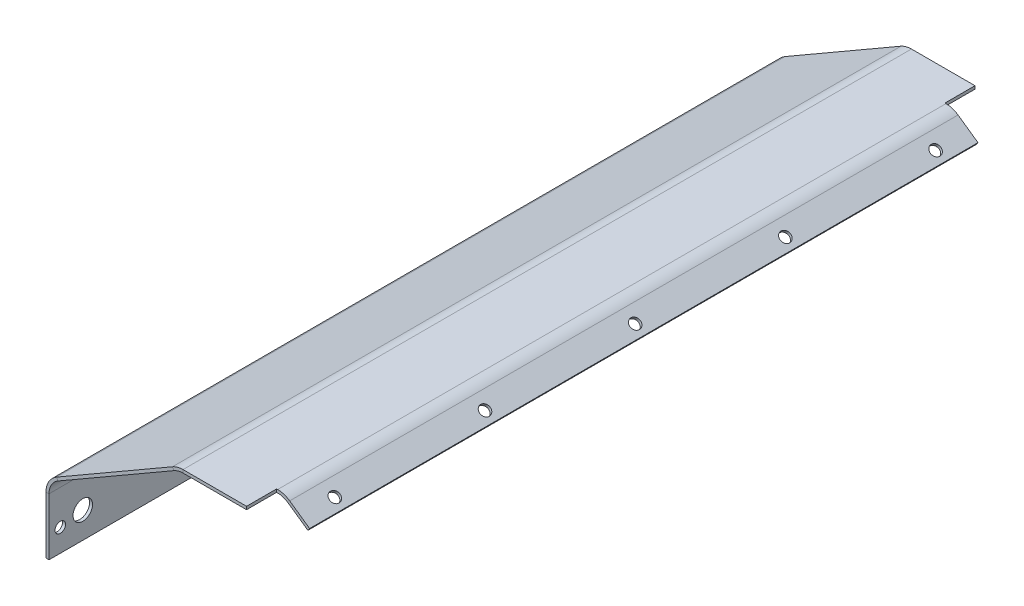
ISO-10303-21;
HEADER;
FILE_DESCRIPTION(('STEP AP214'),'2;1');
FILE_NAME('part.step','',(''),(''),'','','');
FILE_SCHEMA(('AUTOMOTIVE_DESIGN { 1 0 10303 214 1 1 1 1 }'));
ENDSEC;
DATA;
#1=APPLICATION_CONTEXT('core data for automotive mechanical design processes');
#2=APPLICATION_PROTOCOL_DEFINITION('international standard','automotive_design',2000,#1);
#3=PRODUCT_CONTEXT('',#1,'mechanical');
#4=PRODUCT('Part','Part','',(#3));
#5=PRODUCT_RELATED_PRODUCT_CATEGORY('part','',(#4));
#6=PRODUCT_DEFINITION_FORMATION('','',#4);
#7=PRODUCT_DEFINITION_CONTEXT('part definition',#1,'design');
#8=PRODUCT_DEFINITION('design','',#6,#7);
#9=PRODUCT_DEFINITION_SHAPE('','',#8);
#10=(LENGTH_UNIT() NAMED_UNIT(*) SI_UNIT(.MILLI.,.METRE.));
#11=(NAMED_UNIT(*) PLANE_ANGLE_UNIT() SI_UNIT($,.RADIAN.));
#12=(NAMED_UNIT(*) SI_UNIT($,.STERADIAN.) SOLID_ANGLE_UNIT());
#13=UNCERTAINTY_MEASURE_WITH_UNIT(LENGTH_MEASURE(1.E-05),#10,'distance_accuracy_value','');
#14=(GEOMETRIC_REPRESENTATION_CONTEXT(3) GLOBAL_UNCERTAINTY_ASSIGNED_CONTEXT((#13)) GLOBAL_UNIT_ASSIGNED_CONTEXT((#10,
#11,#12)) REPRESENTATION_CONTEXT('',''));
#15=CARTESIAN_POINT('',(0.,0.,0.));
#16=DIRECTION('',(0.,0.,1.));
#17=DIRECTION('',(1.,0.,0.));
#18=AXIS2_PLACEMENT_3D('',#15,#16,#17);
#19=CARTESIAN_POINT('',(0.,15.5717967697245,242.5));
#20=DIRECTION('',(0.,0.,1.));
#21=DIRECTION('',(1.,0.,0.));
#22=AXIS2_PLACEMENT_3D('',#19,#20,#21);
#23=PLANE('',#22);
#24=DIRECTION('',(-1.,0.,0.));
#25=VECTOR('',#24,1.);
#26=CARTESIAN_POINT('',(0.,15.5717967697245,242.5));
#27=LINE('',#26,#25);
#28=CARTESIAN_POINT('',(0.,15.5717967697245,242.5));
#29=VERTEX_POINT('',#28);
#30=CARTESIAN_POINT('',(-2.00000000000001,15.5717967697245,242.5));
#31=VERTEX_POINT('',#30);
#32=EDGE_CURVE('E332',#29,#31,#27,.T.);
#33=ORIENTED_EDGE('',*,*,#32,.F.);
#34=CARTESIAN_POINT('',(12.,15.5717967697245,242.5));
#35=DIRECTION('',(0.,0.,1.));
#36=DIRECTION('',(1.,0.,0.));
#37=AXIS2_PLACEMENT_3D('',#34,#35,#36);
#38=CIRCLE('',#37,12.);
#39=CARTESIAN_POINT('',(5.99999999999997,25.9641016151378,242.5));
#40=VERTEX_POINT('',#39);
#41=EDGE_CURVE('E242',#29,#40,#38,.F.);
#42=ORIENTED_EDGE('',*,*,#41,.T.);
#43=DIRECTION('',(0.500000000000001,-0.866025403784438,0.));
#44=VECTOR('',#43,1.);
#45=CARTESIAN_POINT('',(4.99999999999997,27.6961524227066,242.5));
#46=LINE('',#45,#44);
#47=CARTESIAN_POINT('',(4.99999999999997,27.6961524227066,242.5));
#48=VERTEX_POINT('',#47);
#49=EDGE_CURVE('E330',#48,#40,#46,.T.);
#50=ORIENTED_EDGE('',*,*,#49,.F.);
#51=CARTESIAN_POINT('',(12.,15.5717967697245,242.5));
#52=DIRECTION('',(0.,0.,1.));
#53=DIRECTION('',(1.,0.,0.));
#54=AXIS2_PLACEMENT_3D('',#51,#52,#53);
#55=CIRCLE('',#54,14.);
#56=EDGE_CURVE('E230',#31,#48,#55,.F.);
#57=ORIENTED_EDGE('',*,*,#56,.F.);
#58=EDGE_LOOP('',(#33,#42,#50,#57));
#59=FACE_BOUND('',#58,.T.);
#60=ADVANCED_FACE('F50',(#59),#23,.T.);
#61=CARTESIAN_POINT('',(4.99999999999997,27.6961524227066,242.5));
#62=DIRECTION('',(0.,0.,1.));
#63=DIRECTION('',(1.,0.,0.));
#64=AXIS2_PLACEMENT_3D('',#61,#62,#63);
#65=PLANE('',#64);
#66=DIRECTION('',(0.,1.,0.));
#67=VECTOR('',#66,1.);
#68=CARTESIAN_POINT('',(0.,-22.5,242.5));
#69=LINE('',#68,#67);
#70=CARTESIAN_POINT('',(0.,-22.5,242.5));
#71=VERTEX_POINT('',#70);
#72=EDGE_CURVE('E239',#71,#29,#69,.T.);
#73=ORIENTED_EDGE('',*,*,#72,.T.);
#74=ORIENTED_EDGE('',*,*,#32,.T.);
#75=DIRECTION('',(0.,1.,0.));
#76=VECTOR('',#75,1.);
#77=CARTESIAN_POINT('',(-2.,-22.5,242.5));
#78=LINE('',#77,#76);
#79=CARTESIAN_POINT('',(-2.,-22.5,242.5));
#80=VERTEX_POINT('',#79);
#81=EDGE_CURVE('E233',#80,#31,#78,.T.);
#82=ORIENTED_EDGE('',*,*,#81,.F.);
#83=DIRECTION('',(-1.,0.,0.));
#84=VECTOR('',#83,1.);
#85=CARTESIAN_POINT('',(0.,-22.5,242.5));
#86=LINE('',#85,#84);
#87=EDGE_CURVE('E236',#71,#80,#86,.T.);
#88=ORIENTED_EDGE('',*,*,#87,.F.);
#89=EDGE_LOOP('',(#73,#74,#82,#88));
#90=FACE_BOUND('',#89,.T.);
#91=ADVANCED_FACE('F468',(#90),#65,.T.);
#92=CARTESIAN_POINT('',(5.99999999999997,25.9641016151378,-242.5));
#93=DIRECTION('',(0.,0.,-1.));
#94=DIRECTION('',(-1.,0.,0.));
#95=AXIS2_PLACEMENT_3D('',#92,#93,#94);
#96=PLANE('',#95);
#97=DIRECTION('',(-0.500000000000001,0.866025403784438,0.));
#98=VECTOR('',#97,1.);
#99=CARTESIAN_POINT('',(5.99999999999997,25.9641016151378,-242.5));
#100=LINE('',#99,#98);
#101=CARTESIAN_POINT('',(5.99999999999997,25.9641016151378,-242.5));
#102=VERTEX_POINT('',#101);
#103=CARTESIAN_POINT('',(4.99999999999997,27.6961524227066,-242.5));
#104=VERTEX_POINT('',#103);
#105=EDGE_CURVE('E328',#102,#104,#100,.T.);
#106=ORIENTED_EDGE('',*,*,#105,.F.);
#107=CARTESIAN_POINT('',(12.,15.5717967697245,-242.5));
#108=DIRECTION('',(0.,0.,1.));
#109=DIRECTION('',(1.,0.,0.));
#110=AXIS2_PLACEMENT_3D('',#107,#108,#109);
#111=CIRCLE('',#110,12.);
#112=CARTESIAN_POINT('',(0.,15.5717967697245,-242.5));
#113=VERTEX_POINT('',#112);
#114=EDGE_CURVE('E273',#113,#102,#111,.F.);
#115=ORIENTED_EDGE('',*,*,#114,.F.);
#116=DIRECTION('',(1.,0.,0.));
#117=VECTOR('',#116,1.);
#118=CARTESIAN_POINT('',(-2.00000000000001,15.5717967697245,-242.5));
#119=LINE('',#118,#117);
#120=CARTESIAN_POINT('',(-2.00000000000001,15.5717967697245,-242.5));
#121=VERTEX_POINT('',#120);
#122=EDGE_CURVE('E326',#121,#113,#119,.T.);
#123=ORIENTED_EDGE('',*,*,#122,.F.);
#124=CARTESIAN_POINT('',(12.,15.5717967697245,-242.5));
#125=DIRECTION('',(0.,0.,1.));
#126=DIRECTION('',(1.,0.,0.));
#127=AXIS2_PLACEMENT_3D('',#124,#125,#126);
#128=CIRCLE('',#127,14.);
#129=EDGE_CURVE('E261',#121,#104,#128,.F.);
#130=ORIENTED_EDGE('',*,*,#129,.T.);
#131=EDGE_LOOP('',(#106,#115,#123,#130));
#132=FACE_BOUND('',#131,.T.);
#133=ADVANCED_FACE('F452',(#132),#96,.T.);
#134=CARTESIAN_POINT('',(-2.00000000000001,15.5717967697245,-242.5));
#135=DIRECTION('',(0.,0.,-1.));
#136=DIRECTION('',(-1.,0.,0.));
#137=AXIS2_PLACEMENT_3D('',#134,#135,#136);
#138=PLANE('',#137);
#139=DIRECTION('',(0.866025403784438,0.500000000000001,0.));
#140=VECTOR('',#139,1.);
#141=CARTESIAN_POINT('',(0.,22.5,-242.5));
#142=LINE('',#141,#140);
#143=CARTESIAN_POINT('',(83.2153903091735,70.5444279957213,-242.5));
#144=VERTEX_POINT('',#143);
#145=EDGE_CURVE('E276',#102,#144,#142,.T.);
#146=ORIENTED_EDGE('',*,*,#145,.F.);
#147=ORIENTED_EDGE('',*,*,#105,.T.);
#148=DIRECTION('',(0.866025403784438,0.500000000000001,0.));
#149=VECTOR('',#148,1.);
#150=CARTESIAN_POINT('',(-1.00000000000001,24.2320508075689,-242.5));
#151=LINE('',#150,#149);
#152=CARTESIAN_POINT('',(82.2153903091735,72.2764788032901,-242.5));
#153=VERTEX_POINT('',#152);
#154=EDGE_CURVE('E258',#104,#153,#151,.T.);
#155=ORIENTED_EDGE('',*,*,#154,.T.);
#156=DIRECTION('',(0.499999999999999,-0.866025403784439,0.));
#157=VECTOR('',#156,1.);
#158=CARTESIAN_POINT('',(82.2153903091735,72.2764788032901,-242.5));
#159=LINE('',#158,#157);
#160=EDGE_CURVE('E318',#153,#144,#159,.T.);
#161=ORIENTED_EDGE('',*,*,#160,.T.);
#162=EDGE_LOOP('',(#146,#147,#155,#161));
#163=FACE_BOUND('',#162,.T.);
#164=ADVANCED_FACE('F445',(#163),#138,.T.);
#165=CARTESIAN_POINT('',(83.2153903091735,70.5444279957213,242.5));
#166=DIRECTION('',(0.,0.,1.));
#167=DIRECTION('',(1.,0.,0.));
#168=AXIS2_PLACEMENT_3D('',#165,#166,#167);
#169=PLANE('',#168);
#170=DIRECTION('',(-0.499999999999999,0.866025403784439,0.));
#171=VECTOR('',#170,1.);
#172=CARTESIAN_POINT('',(83.2153903091735,70.5444279957213,242.5));
#173=LINE('',#172,#171);
#174=CARTESIAN_POINT('',(83.2153903091735,70.5444279957213,242.5));
#175=VERTEX_POINT('',#174);
#176=CARTESIAN_POINT('',(82.2153903091735,72.2764788032901,242.5));
#177=VERTEX_POINT('',#176);
#178=EDGE_CURVE('E324',#175,#177,#173,.T.);
#179=ORIENTED_EDGE('',*,*,#178,.F.);
#180=CARTESIAN_POINT('',(89.2153903091735,60.152123150308,242.5));
#181=DIRECTION('',(0.,0.,1.));
#182=DIRECTION('',(1.,0.,0.));
#183=AXIS2_PLACEMENT_3D('',#180,#181,#182);
#184=CIRCLE('',#183,12.);
#185=CARTESIAN_POINT('',(89.2153903091735,72.152123150308,242.5));
#186=VERTEX_POINT('',#185);
#187=EDGE_CURVE('E248',#175,#186,#184,.F.);
#188=ORIENTED_EDGE('',*,*,#187,.T.);
#189=DIRECTION('',(0.,-1.,0.));
#190=VECTOR('',#189,1.);
#191=CARTESIAN_POINT('',(89.2153903091735,74.152123150308,242.5));
#192=LINE('',#191,#190);
#193=CARTESIAN_POINT('',(89.2153903091735,74.152123150308,242.5));
#194=VERTEX_POINT('',#193);
#195=EDGE_CURVE('E322',#194,#186,#192,.T.);
#196=ORIENTED_EDGE('',*,*,#195,.F.);
#197=CARTESIAN_POINT('',(89.2153903091735,60.152123150308,242.5));
#198=DIRECTION('',(0.,0.,1.));
#199=DIRECTION('',(1.,0.,0.));
#200=AXIS2_PLACEMENT_3D('',#197,#198,#199);
#201=CIRCLE('',#200,14.);
#202=EDGE_CURVE('E216',#177,#194,#201,.F.);
#203=ORIENTED_EDGE('',*,*,#202,.F.);
#204=EDGE_LOOP('',(#179,#188,#196,#203));
#205=FACE_BOUND('',#204,.T.);
#206=ADVANCED_FACE('F485',(#205),#169,.T.);
#207=CARTESIAN_POINT('',(89.2153903091735,74.152123150308,242.5));
#208=DIRECTION('',(0.,0.,1.));
#209=DIRECTION('',(1.,0.,0.));
#210=AXIS2_PLACEMENT_3D('',#207,#208,#209);
#211=PLANE('',#210);
#212=DIRECTION('',(0.866025403784438,0.500000000000001,0.));
#213=VECTOR('',#212,1.);
#214=CARTESIAN_POINT('',(0.,22.5,242.5));
#215=LINE('',#214,#213);
#216=EDGE_CURVE('E245',#40,#175,#215,.T.);
#217=ORIENTED_EDGE('',*,*,#216,.T.);
#218=ORIENTED_EDGE('',*,*,#178,.T.);
#219=DIRECTION('',(0.866025403784438,0.500000000000001,0.));
#220=VECTOR('',#219,1.);
#221=CARTESIAN_POINT('',(-1.00000000000001,24.2320508075689,242.5));
#222=LINE('',#221,#220);
#223=EDGE_CURVE('E219',#48,#177,#222,.T.);
#224=ORIENTED_EDGE('',*,*,#223,.F.);
#225=ORIENTED_EDGE('',*,*,#49,.T.);
#226=EDGE_LOOP('',(#217,#218,#224,#225));
#227=FACE_BOUND('',#226,.T.);
#228=ADVANCED_FACE('F482',(#227),#211,.T.);
#229=CARTESIAN_POINT('',(89.2153903091735,72.152123150308,-242.5));
#230=DIRECTION('',(0.,0.,-1.));
#231=DIRECTION('',(-1.,0.,0.));
#232=AXIS2_PLACEMENT_3D('',#229,#230,#231);
#233=PLANE('',#232);
#234=DIRECTION('',(0.,1.,0.));
#235=VECTOR('',#234,1.);
#236=CARTESIAN_POINT('',(89.2153903091735,72.152123150308,-242.5));
#237=LINE('',#236,#235);
#238=CARTESIAN_POINT('',(89.2153903091735,72.152123150308,-242.5));
#239=VERTEX_POINT('',#238);
#240=CARTESIAN_POINT('',(89.2153903091735,74.152123150308,-242.5));
#241=VERTEX_POINT('',#240);
#242=EDGE_CURVE('E320',#239,#241,#237,.T.);
#243=ORIENTED_EDGE('',*,*,#242,.F.);
#244=CARTESIAN_POINT('',(89.2153903091735,60.152123150308,-242.5));
#245=DIRECTION('',(0.,0.,1.));
#246=DIRECTION('',(1.,0.,0.));
#247=AXIS2_PLACEMENT_3D('',#244,#245,#246);
#248=CIRCLE('',#247,12.);
#249=EDGE_CURVE('E222',#144,#239,#248,.F.);
#250=ORIENTED_EDGE('',*,*,#249,.F.);
#251=ORIENTED_EDGE('',*,*,#160,.F.);
#252=CARTESIAN_POINT('',(89.2153903091735,60.152123150308,-242.5));
#253=DIRECTION('',(0.,0.,1.));
#254=DIRECTION('',(1.,0.,0.));
#255=AXIS2_PLACEMENT_3D('',#252,#253,#254);
#256=CIRCLE('',#255,14.);
#257=EDGE_CURVE('E255',#153,#241,#256,.F.);
#258=ORIENTED_EDGE('',*,*,#257,.T.);
#259=EDGE_LOOP('',(#243,#250,#251,#258));
#260=FACE_BOUND('',#259,.T.);
#261=ADVANCED_FACE('F436',(#260),#233,.T.);
#262=CARTESIAN_POINT('',(82.2153903091735,72.2764788032901,-242.5));
#263=DIRECTION('',(0.,0.,-1.));
#264=DIRECTION('',(-1.,0.,0.));
#265=AXIS2_PLACEMENT_3D('',#262,#263,#264);
#266=PLANE('',#265);
#267=DIRECTION('',(0.,1.,0.));
#268=VECTOR('',#267,1.);
#269=CARTESIAN_POINT('',(131.530193758482,-22.5,-242.5));
#270=LINE('',#269,#268);
#271=CARTESIAN_POINT('',(131.530193758482,72.152123150308,-242.5));
#272=VERTEX_POINT('',#271);
#273=CARTESIAN_POINT('',(131.530193758482,74.1521231503079,-242.5));
#274=VERTEX_POINT('',#273);
#275=EDGE_CURVE('E389',#272,#274,#270,.T.);
#276=ORIENTED_EDGE('',*,*,#275,.F.);
#277=DIRECTION('',(1.,0.,0.));
#278=VECTOR('',#277,1.);
#279=CARTESIAN_POINT('',(86.,72.152123150308,-242.5));
#280=LINE('',#279,#278);
#281=EDGE_CURVE('E217',#239,#272,#280,.T.);
#282=ORIENTED_EDGE('',*,*,#281,.F.);
#283=ORIENTED_EDGE('',*,*,#242,.T.);
#284=DIRECTION('',(1.,0.,0.));
#285=VECTOR('',#284,1.);
#286=CARTESIAN_POINT('',(86.,74.152123150308,-242.5));
#287=LINE('',#286,#285);
#288=EDGE_CURVE('E252',#241,#274,#287,.T.);
#289=ORIENTED_EDGE('',*,*,#288,.T.);
#290=EDGE_LOOP('',(#276,#282,#283,#289));
#291=FACE_BOUND('',#290,.T.);
#292=ADVANCED_FACE('F433',(#291),#266,.T.);
#293=CARTESIAN_POINT('',(140.246484642367,71.6202517703539,242.5));
#294=DIRECTION('',(0.,0.,1.));
#295=DIRECTION('',(1.,0.,0.));
#296=AXIS2_PLACEMENT_3D('',#293,#294,#295);
#297=PLANE('',#296);
#298=DIRECTION('',(0.,1.,0.));
#299=VECTOR('',#298,1.);
#300=CARTESIAN_POINT('',(131.530193758482,-22.5,242.5));
#301=LINE('',#300,#299);
#302=CARTESIAN_POINT('',(131.530193758482,72.152123150308,242.5));
#303=VERTEX_POINT('',#302);
#304=CARTESIAN_POINT('',(131.530193758482,74.1521231503079,242.5));
#305=VERTEX_POINT('',#304);
#306=EDGE_CURVE('E193',#303,#305,#301,.T.);
#307=ORIENTED_EDGE('',*,*,#306,.T.);
#308=DIRECTION('',(1.,0.,0.));
#309=VECTOR('',#308,1.);
#310=CARTESIAN_POINT('',(86.,74.152123150308,242.5));
#311=LINE('',#310,#309);
#312=EDGE_CURVE('E206',#194,#305,#311,.T.);
#313=ORIENTED_EDGE('',*,*,#312,.F.);
#314=ORIENTED_EDGE('',*,*,#195,.T.);
#315=DIRECTION('',(1.,0.,0.));
#316=VECTOR('',#315,1.);
#317=CARTESIAN_POINT('',(86.,72.152123150308,242.5));
#318=LINE('',#317,#316);
#319=EDGE_CURVE('E209',#186,#303,#318,.T.);
#320=ORIENTED_EDGE('',*,*,#319,.T.);
#321=EDGE_LOOP('',(#307,#313,#314,#320));
#322=FACE_BOUND('',#321,.T.);
#323=ADVANCED_FACE('F205',(#322),#297,.T.);
#324=CARTESIAN_POINT('',(136.,72.152123150308,242.5));
#325=DIRECTION('',(0.573576436351046,0.819152044288992,0.));
#326=DIRECTION('',(-0.819152044288992,0.573576436351046,0.));
#327=AXIS2_PLACEMENT_3D('',#324,#325,#326);
#328=PLANE('',#327);
#329=CARTESIAN_POINT('',(146.648976575757,64.6956294777444,0.));
#330=DIRECTION('',(0.573576436351046,0.819152044288992,0.));
#331=DIRECTION('',(-0.819152044288992,0.573576436351046,0.));
#332=AXIS2_PLACEMENT_3D('',#329,#330,#331);
#333=CIRCLE('',#332,3.49999999999998);
#334=CARTESIAN_POINT('',(143.781944420745,66.703147004973,0.));
#335=VERTEX_POINT('',#334);
#336=EDGE_CURVE('E899',#335,#335,#333,.T.);
#337=ORIENTED_EDGE('',*,*,#336,.T.);
#338=EDGE_LOOP('',(#337));
#339=FACE_BOUND('',#338,.T.);
#340=CARTESIAN_POINT('',(146.648976575757,64.6956294777443,100.));
#341=DIRECTION('',(0.573576436351046,0.819152044288992,0.));
#342=DIRECTION('',(-0.819152044288992,0.573576436351046,0.));
#343=AXIS2_PLACEMENT_3D('',#340,#341,#342);
#344=CIRCLE('',#343,3.49999999999998);
#345=CARTESIAN_POINT('',(143.781944420745,66.703147004973,100.));
#346=VERTEX_POINT('',#345);
#347=EDGE_CURVE('E903',#346,#346,#344,.T.);
#348=ORIENTED_EDGE('',*,*,#347,.T.);
#349=EDGE_LOOP('',(#348));
#350=FACE_BOUND('',#349,.T.);
#351=CARTESIAN_POINT('',(146.648976575757,64.6956294777443,200.));
#352=DIRECTION('',(0.573576436351046,0.819152044288992,0.));
#353=DIRECTION('',(-0.819152044288992,0.573576436351046,0.));
#354=AXIS2_PLACEMENT_3D('',#351,#352,#353);
#355=CIRCLE('',#354,3.49999999999998);
#356=CARTESIAN_POINT('',(143.781944420746,66.703147004973,200.));
#357=VERTEX_POINT('',#356);
#358=EDGE_CURVE('E912',#357,#357,#355,.T.);
#359=ORIENTED_EDGE('',*,*,#358,.T.);
#360=EDGE_LOOP('',(#359));
#361=FACE_BOUND('',#360,.T.);
#362=CARTESIAN_POINT('',(146.648976575757,64.6956294777444,-100.));
#363=DIRECTION('',(0.573576436351046,0.819152044288992,0.));
#364=DIRECTION('',(-0.819152044288992,0.573576436351046,0.));
#365=AXIS2_PLACEMENT_3D('',#362,#363,#364);
#366=CIRCLE('',#365,3.49999999999998);
#367=CARTESIAN_POINT('',(143.781944420745,66.703147004973,-100.));
#368=VERTEX_POINT('',#367);
#369=EDGE_CURVE('E917',#368,#368,#366,.T.);
#370=ORIENTED_EDGE('',*,*,#369,.T.);
#371=EDGE_LOOP('',(#370));
#372=FACE_BOUND('',#371,.T.);
#373=CARTESIAN_POINT('',(146.648976575757,64.6956294777444,-200.));
#374=DIRECTION('',(0.573576436351046,0.819152044288992,0.));
#375=DIRECTION('',(-0.819152044288992,0.573576436351046,0.));
#376=AXIS2_PLACEMENT_3D('',#373,#374,#375);
#377=CIRCLE('',#376,3.49999999999998);
#378=CARTESIAN_POINT('',(143.781944420745,66.703147004973,-200.));
#379=VERTEX_POINT('',#378);
#380=EDGE_CURVE('E53',#379,#379,#377,.T.);
#381=ORIENTED_EDGE('',*,*,#380,.T.);
#382=EDGE_LOOP('',(#381));
#383=FACE_BOUND('',#382,.T.);
#384=DIRECTION('',(0.,0.,-1.));
#385=VECTOR('',#384,1.);
#386=CARTESIAN_POINT('',(152.38304088578,60.680594423287,242.5));
#387=LINE('',#386,#385);
#388=CARTESIAN_POINT('',(152.38304088578,60.680594423287,222.5));
#389=VERTEX_POINT('',#388);
#390=CARTESIAN_POINT('',(152.38304088578,60.680594423287,-222.5));
#391=VERTEX_POINT('',#390);
#392=EDGE_CURVE('E316',#389,#391,#387,.T.);
#393=ORIENTED_EDGE('',*,*,#392,.F.);
#394=DIRECTION('',(-0.819152044288992,0.573576436351046,0.));
#395=VECTOR('',#394,1.);
#396=CARTESIAN_POINT('',(136.,72.152123150308,222.5));
#397=LINE('',#396,#395);
#398=CARTESIAN_POINT('',(139.099331769665,69.9819476817759,222.5));
#399=VERTEX_POINT('',#398);
#400=EDGE_CURVE('E374',#389,#399,#397,.T.);
#401=ORIENTED_EDGE('',*,*,#400,.T.);
#402=DIRECTION('',(0.,0.,-1.));
#403=VECTOR('',#402,1.);
#404=CARTESIAN_POINT('',(139.099331769665,69.9819476817759,242.5));
#405=LINE('',#404,#403);
#406=CARTESIAN_POINT('',(139.099331769665,69.9819476817759,-222.5));
#407=VERTEX_POINT('',#406);
#408=EDGE_CURVE('E74',#399,#407,#405,.T.);
#409=ORIENTED_EDGE('',*,*,#408,.T.);
#410=DIRECTION('',(0.819152044288992,-0.573576436351046,0.));
#411=VECTOR('',#410,1.);
#412=CARTESIAN_POINT('',(136.,72.152123150308,-222.5));
#413=LINE('',#412,#411);
#414=EDGE_CURVE('E395',#407,#391,#413,.T.);
#415=ORIENTED_EDGE('',*,*,#414,.T.);
#416=EDGE_LOOP('',(#393,#401,#409,#415));
#417=FACE_BOUND('',#416,.T.);
#418=ADVANCED_FACE('F420',(#339,#350,#361,#372,#383,#417),#328,.F.);
#419=CARTESIAN_POINT('',(153.530193758482,62.318898511865,242.5));
#420=DIRECTION('',(0.819152044288993,-0.573576436351045,0.));
#421=DIRECTION('',(0.573576436351045,0.819152044288993,0.));
#422=AXIS2_PLACEMENT_3D('',#419,#420,#421);
#423=PLANE('',#422);
#424=DIRECTION('',(0.573576436351045,0.819152044288993,0.));
#425=VECTOR('',#424,1.);
#426=CARTESIAN_POINT('',(153.530193758482,62.318898511865,222.5));
#427=LINE('',#426,#425);
#428=CARTESIAN_POINT('',(153.530193758482,62.318898511865,222.5));
#429=VERTEX_POINT('',#428);
#430=EDGE_CURVE('E376',#389,#429,#427,.T.);
#431=ORIENTED_EDGE('',*,*,#430,.F.);
#432=ORIENTED_EDGE('',*,*,#392,.T.);
#433=DIRECTION('',(-0.573576436351045,-0.819152044288993,0.));
#434=VECTOR('',#433,1.);
#435=CARTESIAN_POINT('',(153.530193758482,62.318898511865,-222.5));
#436=LINE('',#435,#434);
#437=CARTESIAN_POINT('',(153.530193758482,62.318898511865,-222.5));
#438=VERTEX_POINT('',#437);
#439=EDGE_CURVE('E397',#438,#391,#436,.T.);
#440=ORIENTED_EDGE('',*,*,#439,.F.);
#441=DIRECTION('',(0.,0.,-1.));
#442=VECTOR('',#441,1.);
#443=CARTESIAN_POINT('',(153.530193758482,62.318898511865,242.5));
#444=LINE('',#443,#442);
#445=EDGE_CURVE('E314',#429,#438,#444,.T.);
#446=ORIENTED_EDGE('',*,*,#445,.F.);
#447=EDGE_LOOP('',(#431,#432,#440,#446));
#448=FACE_BOUND('',#447,.T.);
#449=ADVANCED_FACE('F417',(#448),#423,.T.);
#450=CARTESIAN_POINT('',(137.147152872702,73.790427238886,242.5));
#451=DIRECTION('',(0.573576436351046,0.819152044288992,0.));
#452=DIRECTION('',(-0.819152044288992,0.573576436351046,0.));
#453=AXIS2_PLACEMENT_3D('',#450,#451,#452);
#454=PLANE('',#453);
#455=CARTESIAN_POINT('',(147.796129448459,66.3339335663224,0.));
#456=DIRECTION('',(0.573576436351046,0.819152044288992,0.));
#457=DIRECTION('',(-0.819152044288992,0.573576436351046,0.));
#458=AXIS2_PLACEMENT_3D('',#455,#456,#457);
#459=CIRCLE('',#458,3.49999999999999);
#460=CARTESIAN_POINT('',(144.929097293448,68.341451093551,0.));
#461=VERTEX_POINT('',#460);
#462=EDGE_CURVE('E896',#461,#461,#459,.T.);
#463=ORIENTED_EDGE('',*,*,#462,.F.);
#464=EDGE_LOOP('',(#463));
#465=FACE_BOUND('',#464,.T.);
#466=CARTESIAN_POINT('',(147.796129448459,66.3339335663224,100.));
#467=DIRECTION('',(0.573576436351046,0.819152044288992,0.));
#468=DIRECTION('',(-0.819152044288992,0.573576436351046,0.));
#469=AXIS2_PLACEMENT_3D('',#466,#467,#468);
#470=CIRCLE('',#469,3.49999999999999);
#471=CARTESIAN_POINT('',(144.929097293448,68.341451093551,100.));
#472=VERTEX_POINT('',#471);
#473=EDGE_CURVE('E900',#472,#472,#470,.T.);
#474=ORIENTED_EDGE('',*,*,#473,.F.);
#475=EDGE_LOOP('',(#474));
#476=FACE_BOUND('',#475,.T.);
#477=CARTESIAN_POINT('',(147.796129448459,66.3339335663224,200.));
#478=DIRECTION('',(0.573576436351046,0.819152044288992,0.));
#479=DIRECTION('',(-0.819152044288992,0.573576436351046,0.));
#480=AXIS2_PLACEMENT_3D('',#477,#478,#479);
#481=CIRCLE('',#480,3.49999999999998);
#482=CARTESIAN_POINT('',(144.929097293448,68.341451093551,200.));
#483=VERTEX_POINT('',#482);
#484=EDGE_CURVE('E909',#483,#483,#481,.T.);
#485=ORIENTED_EDGE('',*,*,#484,.F.);
#486=EDGE_LOOP('',(#485));
#487=FACE_BOUND('',#486,.T.);
#488=CARTESIAN_POINT('',(147.796129448459,66.3339335663224,-100.));
#489=DIRECTION('',(0.573576436351046,0.819152044288992,0.));
#490=DIRECTION('',(-0.819152044288992,0.573576436351046,0.));
#491=AXIS2_PLACEMENT_3D('',#488,#489,#490);
#492=CIRCLE('',#491,3.49999999999999);
#493=CARTESIAN_POINT('',(144.929097293448,68.341451093551,-100.));
#494=VERTEX_POINT('',#493);
#495=EDGE_CURVE('E915',#494,#494,#492,.T.);
#496=ORIENTED_EDGE('',*,*,#495,.F.);
#497=EDGE_LOOP('',(#496));
#498=FACE_BOUND('',#497,.T.);
#499=CARTESIAN_POINT('',(147.796129448459,66.3339335663224,-200.));
#500=DIRECTION('',(0.573576436351046,0.819152044288992,0.));
#501=DIRECTION('',(-0.819152044288992,0.573576436351046,0.));
#502=AXIS2_PLACEMENT_3D('',#499,#500,#501);
#503=CIRCLE('',#502,3.49999999999998);
#504=CARTESIAN_POINT('',(144.929097293448,68.341451093551,-200.));
#505=VERTEX_POINT('',#504);
#506=EDGE_CURVE('E359',#505,#505,#503,.T.);
#507=ORIENTED_EDGE('',*,*,#506,.F.);
#508=EDGE_LOOP('',(#507));
#509=FACE_BOUND('',#508,.T.);
#510=DIRECTION('',(-0.819152044288992,0.573576436351046,0.));
#511=VECTOR('',#510,1.);
#512=CARTESIAN_POINT('',(137.147152872702,73.790427238886,222.5));
#513=LINE('',#512,#511);
#514=CARTESIAN_POINT('',(140.246484642367,71.6202517703539,222.5));
#515=VERTEX_POINT('',#514);
#516=EDGE_CURVE('E378',#429,#515,#513,.T.);
#517=ORIENTED_EDGE('',*,*,#516,.F.);
#518=ORIENTED_EDGE('',*,*,#445,.T.);
#519=DIRECTION('',(0.819152044288992,-0.573576436351046,0.));
#520=VECTOR('',#519,1.);
#521=CARTESIAN_POINT('',(137.147152872702,73.790427238886,-222.5));
#522=LINE('',#521,#520);
#523=CARTESIAN_POINT('',(140.246484642367,71.6202517703539,-222.5));
#524=VERTEX_POINT('',#523);
#525=EDGE_CURVE('E399',#524,#438,#522,.T.);
#526=ORIENTED_EDGE('',*,*,#525,.F.);
#527=DIRECTION('',(0.,0.,-1.));
#528=VECTOR('',#527,1.);
#529=CARTESIAN_POINT('',(140.246484642367,71.6202517703539,242.5));
#530=LINE('',#529,#528);
#531=EDGE_CURVE('E312',#515,#524,#530,.T.);
#532=ORIENTED_EDGE('',*,*,#531,.F.);
#533=EDGE_LOOP('',(#517,#518,#526,#532));
#534=FACE_BOUND('',#533,.T.);
#535=ADVANCED_FACE('F413',(#465,#476,#487,#498,#509,#534),#454,.T.);
#536=CARTESIAN_POINT('',(132.216414533452,60.152123150308,242.5));
#537=DIRECTION('',(0.,0.,-1.));
#538=DIRECTION('',(-1.,0.,0.));
#539=AXIS2_PLACEMENT_3D('',#536,#537,#538);
#540=CYLINDRICAL_SURFACE('',#539,14.);
#541=CARTESIAN_POINT('',(132.216414533452,60.152123150308,222.5));
#542=DIRECTION('',(0.,0.,-1.));
#543=DIRECTION('',(-1.,0.,0.));
#544=AXIS2_PLACEMENT_3D('',#541,#542,#543);
#545=CIRCLE('',#544,14.);
#546=CARTESIAN_POINT('',(132.216414533452,74.1521231503079,222.5));
#547=VERTEX_POINT('',#546);
#548=EDGE_CURVE('E380',#515,#547,#545,.F.);
#549=ORIENTED_EDGE('',*,*,#548,.F.);
#550=ORIENTED_EDGE('',*,*,#531,.T.);
#551=CARTESIAN_POINT('',(132.216414533452,60.152123150308,-222.5));
#552=DIRECTION('',(0.,0.,1.));
#553=DIRECTION('',(1.,0.,0.));
#554=AXIS2_PLACEMENT_3D('',#551,#552,#553);
#555=CIRCLE('',#554,14.);
#556=CARTESIAN_POINT('',(132.216414533452,74.1521231503079,-222.5));
#557=VERTEX_POINT('',#556);
#558=EDGE_CURVE('E225',#557,#524,#555,.F.);
#559=ORIENTED_EDGE('',*,*,#558,.F.);
#560=DIRECTION('',(0.,0.,-1.));
#561=VECTOR('',#560,1.);
#562=CARTESIAN_POINT('',(132.216414533452,74.152123150308,242.5));
#563=LINE('',#562,#561);
#564=EDGE_CURVE('E310',#547,#557,#563,.T.);
#565=ORIENTED_EDGE('',*,*,#564,.F.);
#566=EDGE_LOOP('',(#549,#550,#559,#565));
#567=FACE_BOUND('',#566,.T.);
#568=ADVANCED_FACE('F492',(#567),#540,.T.);
#569=CARTESIAN_POINT('',(86.,74.152123150308,242.5));
#570=DIRECTION('',(0.,1.,0.));
#571=DIRECTION('',(-1.,0.,0.));
#572=AXIS2_PLACEMENT_3D('',#569,#570,#571);
#573=PLANE('',#572);
#574=DIRECTION('',(0.,0.,1.));
#575=VECTOR('',#574,1.);
#576=CARTESIAN_POINT('',(131.530193758482,74.1521231503079,242.5));
#577=LINE('',#576,#575);
#578=CARTESIAN_POINT('',(131.530193758482,74.1521231503079,222.5));
#579=VERTEX_POINT('',#578);
#580=EDGE_CURVE('E190',#579,#305,#577,.T.);
#581=ORIENTED_EDGE('',*,*,#580,.F.);
#582=DIRECTION('',(-1.,0.,0.));
#583=VECTOR('',#582,1.);
#584=CARTESIAN_POINT('',(131.530193758482,74.1521231503079,222.5));
#585=LINE('',#584,#583);
#586=EDGE_CURVE('E199',#547,#579,#585,.T.);
#587=ORIENTED_EDGE('',*,*,#586,.F.);
#588=ORIENTED_EDGE('',*,*,#564,.T.);
#589=DIRECTION('',(1.,0.,0.));
#590=VECTOR('',#589,1.);
#591=CARTESIAN_POINT('',(131.530193758482,74.1521231503079,-222.5));
#592=LINE('',#591,#590);
#593=CARTESIAN_POINT('',(131.530193758482,74.1521231503079,-222.5));
#594=VERTEX_POINT('',#593);
#595=EDGE_CURVE('E385',#594,#557,#592,.T.);
#596=ORIENTED_EDGE('',*,*,#595,.F.);
#597=DIRECTION('',(0.,0.,1.));
#598=VECTOR('',#597,1.);
#599=CARTESIAN_POINT('',(131.530193758482,74.1521231503079,-242.5));
#600=LINE('',#599,#598);
#601=EDGE_CURVE('E382',#274,#594,#600,.T.);
#602=ORIENTED_EDGE('',*,*,#601,.F.);
#603=ORIENTED_EDGE('',*,*,#288,.F.);
#604=DIRECTION('',(0.,0.,-1.));
#605=VECTOR('',#604,1.);
#606=CARTESIAN_POINT('',(89.2153903091735,74.152123150308,242.5));
#607=LINE('',#606,#605);
#608=EDGE_CURVE('E215',#194,#241,#607,.T.);
#609=ORIENTED_EDGE('',*,*,#608,.F.);
#610=ORIENTED_EDGE('',*,*,#312,.T.);
#611=EDGE_LOOP('',(#581,#587,#588,#596,#602,#603,#609,#610));
#612=FACE_BOUND('',#611,.T.);
#613=ADVANCED_FACE('F212',(#612),#573,.T.);
#614=CARTESIAN_POINT('',(89.2153903091735,60.152123150308,242.5));
#615=DIRECTION('',(0.,0.,-1.));
#616=DIRECTION('',(-1.,0.,0.));
#617=AXIS2_PLACEMENT_3D('',#614,#615,#616);
#618=CYLINDRICAL_SURFACE('',#617,14.);
#619=ORIENTED_EDGE('',*,*,#257,.F.);
#620=DIRECTION('',(0.,0.,-1.));
#621=VECTOR('',#620,1.);
#622=CARTESIAN_POINT('',(82.2153903091735,72.2764788032901,242.5));
#623=LINE('',#622,#621);
#624=EDGE_CURVE('E306',#177,#153,#623,.T.);
#625=ORIENTED_EDGE('',*,*,#624,.F.);
#626=ORIENTED_EDGE('',*,*,#202,.T.);
#627=ORIENTED_EDGE('',*,*,#608,.T.);
#628=EDGE_LOOP('',(#619,#625,#626,#627));
#629=FACE_BOUND('',#628,.T.);
#630=ADVANCED_FACE('F440',(#629),#618,.T.);
#631=CARTESIAN_POINT('',(-1.00000000000001,24.2320508075689,242.5));
#632=DIRECTION('',(-0.500000000000001,0.866025403784438,0.));
#633=DIRECTION('',(-0.866025403784438,-0.500000000000001,0.));
#634=AXIS2_PLACEMENT_3D('',#631,#632,#633);
#635=PLANE('',#634);
#636=ORIENTED_EDGE('',*,*,#154,.F.);
#637=DIRECTION('',(0.,0.,-1.));
#638=VECTOR('',#637,1.);
#639=CARTESIAN_POINT('',(4.99999999999997,27.6961524227066,242.5));
#640=LINE('',#639,#638);
#641=EDGE_CURVE('E303',#48,#104,#640,.T.);
#642=ORIENTED_EDGE('',*,*,#641,.F.);
#643=ORIENTED_EDGE('',*,*,#223,.T.);
#644=ORIENTED_EDGE('',*,*,#624,.T.);
#645=EDGE_LOOP('',(#636,#642,#643,#644));
#646=FACE_BOUND('',#645,.T.);
#647=ADVANCED_FACE('F448',(#646),#635,.T.);
#648=CARTESIAN_POINT('',(12.,15.5717967697245,242.5));
#649=DIRECTION('',(0.,0.,-1.));
#650=DIRECTION('',(-1.,0.,0.));
#651=AXIS2_PLACEMENT_3D('',#648,#649,#650);
#652=CYLINDRICAL_SURFACE('',#651,14.);
#653=ORIENTED_EDGE('',*,*,#129,.F.);
#654=DIRECTION('',(0.,0.,-1.));
#655=VECTOR('',#654,1.);
#656=CARTESIAN_POINT('',(-2.00000000000001,15.5717967697245,242.5));
#657=LINE('',#656,#655);
#658=EDGE_CURVE('E300',#31,#121,#657,.T.);
#659=ORIENTED_EDGE('',*,*,#658,.F.);
#660=ORIENTED_EDGE('',*,*,#56,.T.);
#661=ORIENTED_EDGE('',*,*,#641,.T.);
#662=EDGE_LOOP('',(#653,#659,#660,#661));
#663=FACE_BOUND('',#662,.T.);
#664=ADVANCED_FACE('F456',(#663),#652,.T.);
#665=CARTESIAN_POINT('',(-2.,-22.5,242.5));
#666=DIRECTION('',(-1.,0.,0.));
#667=DIRECTION('',(0.,-1.,0.));
#668=AXIS2_PLACEMENT_3D('',#665,#666,#667);
#669=PLANE('',#668);
#670=CARTESIAN_POINT('',(-2.00000000000001,-5.,-220.));
#671=DIRECTION('',(-1.,0.,0.));
#672=DIRECTION('',(0.,0.,1.));
#673=AXIS2_PLACEMENT_3D('',#670,#671,#672);
#674=CIRCLE('',#673,6.49999999999999);
#675=CARTESIAN_POINT('',(-2.00000000000001,-5.,-213.5));
#676=VERTEX_POINT('',#675);
#677=EDGE_CURVE('E348',#676,#676,#674,.T.);
#678=ORIENTED_EDGE('',*,*,#677,.F.);
#679=EDGE_LOOP('',(#678));
#680=FACE_BOUND('',#679,.T.);
#681=CARTESIAN_POINT('',(-2.00000000000001,-5.,220.));
#682=DIRECTION('',(-1.,0.,0.));
#683=DIRECTION('',(0.,0.,1.));
#684=AXIS2_PLACEMENT_3D('',#681,#682,#683);
#685=CIRCLE('',#684,6.49999999999999);
#686=CARTESIAN_POINT('',(-2.00000000000001,-5.,226.5));
#687=VERTEX_POINT('',#686);
#688=EDGE_CURVE('E347',#687,#687,#685,.T.);
#689=ORIENTED_EDGE('',*,*,#688,.F.);
#690=EDGE_LOOP('',(#689));
#691=FACE_BOUND('',#690,.T.);
#692=CARTESIAN_POINT('',(-2.,-7.49999999999999,235.));
#693=DIRECTION('',(-1.,0.,0.));
#694=DIRECTION('',(0.,0.,1.));
#695=AXIS2_PLACEMENT_3D('',#692,#693,#694);
#696=CIRCLE('',#695,3.49999999999999);
#697=CARTESIAN_POINT('',(-2.,-7.49999999999999,238.5));
#698=VERTEX_POINT('',#697);
#699=EDGE_CURVE('E344',#698,#698,#696,.T.);
#700=ORIENTED_EDGE('',*,*,#699,.F.);
#701=EDGE_LOOP('',(#700));
#702=FACE_BOUND('',#701,.T.);
#703=CARTESIAN_POINT('',(-2.,-7.49999999999999,-235.));
#704=DIRECTION('',(-1.,0.,0.));
#705=DIRECTION('',(0.,0.,1.));
#706=AXIS2_PLACEMENT_3D('',#703,#704,#705);
#707=CIRCLE('',#706,3.49999999999999);
#708=CARTESIAN_POINT('',(-2.,-7.49999999999999,-231.5));
#709=VERTEX_POINT('',#708);
#710=EDGE_CURVE('E343',#709,#709,#707,.T.);
#711=ORIENTED_EDGE('',*,*,#710,.F.);
#712=EDGE_LOOP('',(#711));
#713=FACE_BOUND('',#712,.T.);
#714=DIRECTION('',(0.,1.,0.));
#715=VECTOR('',#714,1.);
#716=CARTESIAN_POINT('',(-2.,-22.5,-242.5));
#717=LINE('',#716,#715);
#718=CARTESIAN_POINT('',(-2.,-22.5,-242.5));
#719=VERTEX_POINT('',#718);
#720=EDGE_CURVE('E264',#719,#121,#717,.T.);
#721=ORIENTED_EDGE('',*,*,#720,.F.);
#722=DIRECTION('',(0.,0.,-1.));
#723=VECTOR('',#722,1.);
#724=CARTESIAN_POINT('',(-2.,-22.5,242.5));
#725=LINE('',#724,#723);
#726=EDGE_CURVE('E298',#80,#719,#725,.T.);
#727=ORIENTED_EDGE('',*,*,#726,.F.);
#728=ORIENTED_EDGE('',*,*,#81,.T.);
#729=ORIENTED_EDGE('',*,*,#658,.T.);
#730=EDGE_LOOP('',(#721,#727,#728,#729));
#731=FACE_BOUND('',#730,.T.);
#732=ADVANCED_FACE('F464',(#680,#691,#702,#713,#731),#669,.T.);
#733=CARTESIAN_POINT('',(0.,-22.5,242.5));
#734=DIRECTION('',(0.,-1.,0.));
#735=DIRECTION('',(0.,0.,-1.));
#736=AXIS2_PLACEMENT_3D('',#733,#734,#735);
#737=PLANE('',#736);
#738=DIRECTION('',(-1.,0.,0.));
#739=VECTOR('',#738,1.);
#740=CARTESIAN_POINT('',(0.,-22.5,-242.5));
#741=LINE('',#740,#739);
#742=CARTESIAN_POINT('',(0.,-22.5,-242.5));
#743=VERTEX_POINT('',#742);
#744=EDGE_CURVE('E267',#743,#719,#741,.T.);
#745=ORIENTED_EDGE('',*,*,#744,.F.);
#746=DIRECTION('',(0.,0.,-1.));
#747=VECTOR('',#746,1.);
#748=CARTESIAN_POINT('',(0.,-22.5,242.5));
#749=LINE('',#748,#747);
#750=EDGE_CURVE('E296',#71,#743,#749,.T.);
#751=ORIENTED_EDGE('',*,*,#750,.F.);
#752=ORIENTED_EDGE('',*,*,#87,.T.);
#753=ORIENTED_EDGE('',*,*,#726,.T.);
#754=EDGE_LOOP('',(#745,#751,#752,#753));
#755=FACE_BOUND('',#754,.T.);
#756=ADVANCED_FACE('F470',(#755),#737,.T.);
#757=CARTESIAN_POINT('',(0.,-22.5,242.5));
#758=DIRECTION('',(-1.,0.,0.));
#759=DIRECTION('',(0.,-1.,0.));
#760=AXIS2_PLACEMENT_3D('',#757,#758,#759);
#761=PLANE('',#760);
#762=CARTESIAN_POINT('',(0.,-5.,-220.));
#763=DIRECTION('',(-1.,0.,0.));
#764=DIRECTION('',(0.,-1.,0.));
#765=AXIS2_PLACEMENT_3D('',#762,#763,#764);
#766=CIRCLE('',#765,6.49999999999998);
#767=CARTESIAN_POINT('',(0.,-11.5,-220.));
#768=VERTEX_POINT('',#767);
#769=EDGE_CURVE('E345',#768,#768,#766,.T.);
#770=ORIENTED_EDGE('',*,*,#769,.T.);
#771=EDGE_LOOP('',(#770));
#772=FACE_BOUND('',#771,.T.);
#773=CARTESIAN_POINT('',(0.,-5.,220.));
#774=DIRECTION('',(-1.,0.,0.));
#775=DIRECTION('',(0.,-1.,0.));
#776=AXIS2_PLACEMENT_3D('',#773,#774,#775);
#777=CIRCLE('',#776,6.49999999999998);
#778=CARTESIAN_POINT('',(0.,-11.5,220.));
#779=VERTEX_POINT('',#778);
#780=EDGE_CURVE('E352',#779,#779,#777,.T.);
#781=ORIENTED_EDGE('',*,*,#780,.T.);
#782=EDGE_LOOP('',(#781));
#783=FACE_BOUND('',#782,.T.);
#784=CARTESIAN_POINT('',(0.,-7.49999999999999,235.));
#785=DIRECTION('',(-1.,0.,0.));
#786=DIRECTION('',(0.,-1.,0.));
#787=AXIS2_PLACEMENT_3D('',#784,#785,#786);
#788=CIRCLE('',#787,3.49999999999998);
#789=CARTESIAN_POINT('',(0.,-11.,235.));
#790=VERTEX_POINT('',#789);
#791=EDGE_CURVE('E341',#790,#790,#788,.T.);
#792=ORIENTED_EDGE('',*,*,#791,.T.);
#793=EDGE_LOOP('',(#792));
#794=FACE_BOUND('',#793,.T.);
#795=CARTESIAN_POINT('',(0.,-7.49999999999999,-235.));
#796=DIRECTION('',(-1.,0.,0.));
#797=DIRECTION('',(0.,-1.,0.));
#798=AXIS2_PLACEMENT_3D('',#795,#796,#797);
#799=CIRCLE('',#798,3.49999999999998);
#800=CARTESIAN_POINT('',(0.,-11.,-235.));
#801=VERTEX_POINT('',#800);
#802=EDGE_CURVE('E200',#801,#801,#799,.T.);
#803=ORIENTED_EDGE('',*,*,#802,.T.);
#804=EDGE_LOOP('',(#803));
#805=FACE_BOUND('',#804,.T.);
#806=DIRECTION('',(0.,1.,0.));
#807=VECTOR('',#806,1.);
#808=CARTESIAN_POINT('',(0.,-22.5,-242.5));
#809=LINE('',#808,#807);
#810=EDGE_CURVE('E270',#743,#113,#809,.T.);
#811=ORIENTED_EDGE('',*,*,#810,.T.);
#812=DIRECTION('',(0.,0.,-1.));
#813=VECTOR('',#812,1.);
#814=CARTESIAN_POINT('',(0.,15.5717967697245,242.5));
#815=LINE('',#814,#813);
#816=EDGE_CURVE('E293',#29,#113,#815,.T.);
#817=ORIENTED_EDGE('',*,*,#816,.F.);
#818=ORIENTED_EDGE('',*,*,#72,.F.);
#819=ORIENTED_EDGE('',*,*,#750,.T.);
#820=EDGE_LOOP('',(#811,#817,#818,#819));
#821=FACE_BOUND('',#820,.T.);
#822=ADVANCED_FACE('F474',(#772,#783,#794,#805,#821),#761,.F.);
#823=CARTESIAN_POINT('',(12.,15.5717967697245,242.5));
#824=DIRECTION('',(0.,0.,-1.));
#825=DIRECTION('',(-1.,0.,0.));
#826=AXIS2_PLACEMENT_3D('',#823,#824,#825);
#827=CYLINDRICAL_SURFACE('',#826,12.);
#828=ORIENTED_EDGE('',*,*,#114,.T.);
#829=DIRECTION('',(0.,0.,-1.));
#830=VECTOR('',#829,1.);
#831=CARTESIAN_POINT('',(5.99999999999997,25.9641016151378,242.5));
#832=LINE('',#831,#830);
#833=EDGE_CURVE('E290',#40,#102,#832,.T.);
#834=ORIENTED_EDGE('',*,*,#833,.F.);
#835=ORIENTED_EDGE('',*,*,#41,.F.);
#836=ORIENTED_EDGE('',*,*,#816,.T.);
#837=EDGE_LOOP('',(#828,#834,#835,#836));
#838=FACE_BOUND('',#837,.T.);
#839=ADVANCED_FACE('F478',(#838),#827,.F.);
#840=CARTESIAN_POINT('',(0.,22.5,242.5));
#841=DIRECTION('',(-0.500000000000001,0.866025403784438,0.));
#842=DIRECTION('',(-0.866025403784438,-0.500000000000001,0.));
#843=AXIS2_PLACEMENT_3D('',#840,#841,#842);
#844=PLANE('',#843);
#845=ORIENTED_EDGE('',*,*,#145,.T.);
#846=DIRECTION('',(0.,0.,-1.));
#847=VECTOR('',#846,1.);
#848=CARTESIAN_POINT('',(83.2153903091735,70.5444279957213,242.5));
#849=LINE('',#848,#847);
#850=EDGE_CURVE('E287',#175,#144,#849,.T.);
#851=ORIENTED_EDGE('',*,*,#850,.F.);
#852=ORIENTED_EDGE('',*,*,#216,.F.);
#853=ORIENTED_EDGE('',*,*,#833,.T.);
#854=EDGE_LOOP('',(#845,#851,#852,#853));
#855=FACE_BOUND('',#854,.T.);
#856=ADVANCED_FACE('F630',(#855),#844,.F.);
#857=CARTESIAN_POINT('',(89.2153903091735,60.152123150308,242.5));
#858=DIRECTION('',(0.,0.,-1.));
#859=DIRECTION('',(-1.,0.,0.));
#860=AXIS2_PLACEMENT_3D('',#857,#858,#859);
#861=CYLINDRICAL_SURFACE('',#860,12.);
#862=ORIENTED_EDGE('',*,*,#249,.T.);
#863=DIRECTION('',(0.,0.,-1.));
#864=VECTOR('',#863,1.);
#865=CARTESIAN_POINT('',(89.2153903091735,72.152123150308,242.5));
#866=LINE('',#865,#864);
#867=EDGE_CURVE('E284',#186,#239,#866,.T.);
#868=ORIENTED_EDGE('',*,*,#867,.F.);
#869=ORIENTED_EDGE('',*,*,#187,.F.);
#870=ORIENTED_EDGE('',*,*,#850,.T.);
#871=EDGE_LOOP('',(#862,#868,#869,#870));
#872=FACE_BOUND('',#871,.T.);
#873=ADVANCED_FACE('F489',(#872),#861,.F.);
#874=CARTESIAN_POINT('',(86.,72.152123150308,242.5));
#875=DIRECTION('',(0.,1.,0.));
#876=DIRECTION('',(-1.,0.,0.));
#877=AXIS2_PLACEMENT_3D('',#874,#875,#876);
#878=PLANE('',#877);
#879=DIRECTION('',(-1.,0.,0.));
#880=VECTOR('',#879,1.);
#881=CARTESIAN_POINT('',(86.,72.152123150308,222.5));
#882=LINE('',#881,#880);
#883=CARTESIAN_POINT('',(132.216414533452,72.152123150308,222.5));
#884=VERTEX_POINT('',#883);
#885=CARTESIAN_POINT('',(131.530193758482,72.152123150308,222.5));
#886=VERTEX_POINT('',#885);
#887=EDGE_CURVE('E66',#884,#886,#882,.T.);
#888=ORIENTED_EDGE('',*,*,#887,.T.);
#889=DIRECTION('',(0.,0.,1.));
#890=VECTOR('',#889,1.);
#891=CARTESIAN_POINT('',(131.530193758482,72.152123150308,242.5));
#892=LINE('',#891,#890);
#893=EDGE_CURVE('E13',#886,#303,#892,.T.);
#894=ORIENTED_EDGE('',*,*,#893,.T.);
#895=ORIENTED_EDGE('',*,*,#319,.F.);
#896=ORIENTED_EDGE('',*,*,#867,.T.);
#897=ORIENTED_EDGE('',*,*,#281,.T.);
#898=DIRECTION('',(0.,0.,1.));
#899=VECTOR('',#898,1.);
#900=CARTESIAN_POINT('',(131.530193758482,72.152123150308,242.5));
#901=LINE('',#900,#899);
#902=CARTESIAN_POINT('',(131.530193758482,72.152123150308,-222.5));
#903=VERTEX_POINT('',#902);
#904=EDGE_CURVE('E337',#272,#903,#901,.T.);
#905=ORIENTED_EDGE('',*,*,#904,.T.);
#906=DIRECTION('',(1.,0.,0.));
#907=VECTOR('',#906,1.);
#908=CARTESIAN_POINT('',(86.,72.152123150308,-222.5));
#909=LINE('',#908,#907);
#910=CARTESIAN_POINT('',(132.216414533452,72.152123150308,-222.5));
#911=VERTEX_POINT('',#910);
#912=EDGE_CURVE('E391',#903,#911,#909,.T.);
#913=ORIENTED_EDGE('',*,*,#912,.T.);
#914=DIRECTION('',(0.,0.,-1.));
#915=VECTOR('',#914,1.);
#916=CARTESIAN_POINT('',(132.216414533452,72.152123150308,242.5));
#917=LINE('',#916,#915);
#918=EDGE_CURVE('E282',#884,#911,#917,.T.);
#919=ORIENTED_EDGE('',*,*,#918,.F.);
#920=EDGE_LOOP('',(#888,#894,#895,#896,#897,#905,#913,#919));
#921=FACE_BOUND('',#920,.T.);
#922=ADVANCED_FACE('F426',(#921),#878,.F.);
#923=CARTESIAN_POINT('',(132.216414533452,60.152123150308,242.5));
#924=DIRECTION('',(0.,0.,-1.));
#925=DIRECTION('',(-1.,0.,0.));
#926=AXIS2_PLACEMENT_3D('',#923,#924,#925);
#927=CYLINDRICAL_SURFACE('',#926,12.);
#928=ORIENTED_EDGE('',*,*,#408,.F.);
#929=CARTESIAN_POINT('',(132.216414533452,60.152123150308,222.5));
#930=DIRECTION('',(0.,0.,-1.));
#931=DIRECTION('',(-1.,0.,0.));
#932=AXIS2_PLACEMENT_3D('',#929,#930,#931);
#933=CIRCLE('',#932,12.);
#934=EDGE_CURVE('E58',#399,#884,#933,.F.);
#935=ORIENTED_EDGE('',*,*,#934,.T.);
#936=ORIENTED_EDGE('',*,*,#918,.T.);
#937=CARTESIAN_POINT('',(132.216414533452,60.152123150308,-222.5));
#938=DIRECTION('',(0.,0.,1.));
#939=DIRECTION('',(1.,0.,0.));
#940=AXIS2_PLACEMENT_3D('',#937,#938,#939);
#941=CIRCLE('',#940,12.);
#942=EDGE_CURVE('E334',#911,#407,#941,.F.);
#943=ORIENTED_EDGE('',*,*,#942,.T.);
#944=EDGE_LOOP('',(#928,#935,#936,#943));
#945=FACE_BOUND('',#944,.T.);
#946=ADVANCED_FACE('F422',(#945),#927,.F.);
#947=CARTESIAN_POINT('',(132.216414533452,60.152123150308,-242.5));
#948=DIRECTION('',(0.,0.,1.));
#949=DIRECTION('',(1.,0.,0.));
#950=AXIS2_PLACEMENT_3D('',#947,#948,#949);
#951=PLANE('',#950);
#952=ORIENTED_EDGE('',*,*,#720,.T.);
#953=ORIENTED_EDGE('',*,*,#122,.T.);
#954=ORIENTED_EDGE('',*,*,#810,.F.);
#955=ORIENTED_EDGE('',*,*,#744,.T.);
#956=EDGE_LOOP('',(#952,#953,#954,#955));
#957=FACE_BOUND('',#956,.T.);
#958=ADVANCED_FACE('F460',(#957),#951,.F.);
#959=CARTESIAN_POINT('',(131.530193758482,-22.5,-242.5));
#960=DIRECTION('',(-1.,0.,0.));
#961=DIRECTION('',(0.,0.,1.));
#962=AXIS2_PLACEMENT_3D('',#959,#960,#961);
#963=PLANE('',#962);
#964=ORIENTED_EDGE('',*,*,#275,.T.);
#965=ORIENTED_EDGE('',*,*,#601,.T.);
#966=DIRECTION('',(0.,1.,0.));
#967=VECTOR('',#966,1.);
#968=CARTESIAN_POINT('',(131.530193758482,-22.5,-222.5));
#969=LINE('',#968,#967);
#970=EDGE_CURVE('E388',#903,#594,#969,.T.);
#971=ORIENTED_EDGE('',*,*,#970,.F.);
#972=ORIENTED_EDGE('',*,*,#904,.F.);
#973=EDGE_LOOP('',(#964,#965,#971,#972));
#974=FACE_BOUND('',#973,.T.);
#975=ADVANCED_FACE('F430',(#974),#963,.F.);
#976=CARTESIAN_POINT('',(131.530193758482,-22.5,-222.5));
#977=DIRECTION('',(0.,0.,1.));
#978=DIRECTION('',(1.,0.,0.));
#979=AXIS2_PLACEMENT_3D('',#976,#977,#978);
#980=PLANE('',#979);
#981=ORIENTED_EDGE('',*,*,#558,.T.);
#982=ORIENTED_EDGE('',*,*,#525,.T.);
#983=ORIENTED_EDGE('',*,*,#439,.T.);
#984=ORIENTED_EDGE('',*,*,#414,.F.);
#985=ORIENTED_EDGE('',*,*,#942,.F.);
#986=ORIENTED_EDGE('',*,*,#912,.F.);
#987=ORIENTED_EDGE('',*,*,#970,.T.);
#988=ORIENTED_EDGE('',*,*,#595,.T.);
#989=EDGE_LOOP('',(#981,#982,#983,#984,#985,#986,#987,#988));
#990=FACE_BOUND('',#989,.T.);
#991=ADVANCED_FACE('F406',(#990),#980,.F.);
#992=CARTESIAN_POINT('',(131.530193758482,-22.5,242.5));
#993=DIRECTION('',(-1.,0.,0.));
#994=DIRECTION('',(0.,0.,1.));
#995=AXIS2_PLACEMENT_3D('',#992,#993,#994);
#996=PLANE('',#995);
#997=DIRECTION('',(0.,1.,0.));
#998=VECTOR('',#997,1.);
#999=CARTESIAN_POINT('',(131.530193758482,-22.5,222.5));
#1000=LINE('',#999,#998);
#1001=EDGE_CURVE('E194',#886,#579,#1000,.T.);
#1002=ORIENTED_EDGE('',*,*,#1001,.T.);
#1003=ORIENTED_EDGE('',*,*,#580,.T.);
#1004=ORIENTED_EDGE('',*,*,#306,.F.);
#1005=ORIENTED_EDGE('',*,*,#893,.F.);
#1006=EDGE_LOOP('',(#1002,#1003,#1004,#1005));
#1007=FACE_BOUND('',#1006,.T.);
#1008=ADVANCED_FACE('F192',(#1007),#996,.F.);
#1009=CARTESIAN_POINT('',(131.530193758482,-22.5,222.5));
#1010=DIRECTION('',(0.,0.,-1.));
#1011=DIRECTION('',(-1.,0.,0.));
#1012=AXIS2_PLACEMENT_3D('',#1009,#1010,#1011);
#1013=PLANE('',#1012);
#1014=ORIENTED_EDGE('',*,*,#548,.T.);
#1015=ORIENTED_EDGE('',*,*,#586,.T.);
#1016=ORIENTED_EDGE('',*,*,#1001,.F.);
#1017=ORIENTED_EDGE('',*,*,#887,.F.);
#1018=ORIENTED_EDGE('',*,*,#934,.F.);
#1019=ORIENTED_EDGE('',*,*,#400,.F.);
#1020=ORIENTED_EDGE('',*,*,#430,.T.);
#1021=ORIENTED_EDGE('',*,*,#516,.T.);
#1022=EDGE_LOOP('',(#1014,#1015,#1016,#1017,#1018,#1019,#1020,#1021));
#1023=FACE_BOUND('',#1022,.T.);
#1024=ADVANCED_FACE('F490',(#1023),#1013,.F.);
#1025=CARTESIAN_POINT('',(-2.,-7.49999999999999,-235.));
#1026=DIRECTION('',(-1.,0.,0.));
#1027=DIRECTION('',(0.,0.,1.));
#1028=AXIS2_PLACEMENT_3D('',#1025,#1026,#1027);
#1029=CYLINDRICAL_SURFACE('',#1028,3.49999999999998);
#1030=ORIENTED_EDGE('',*,*,#710,.T.);
#1031=EDGE_LOOP('',(#1030));
#1032=FACE_BOUND('',#1031,.T.);
#1033=ORIENTED_EDGE('',*,*,#802,.F.);
#1034=EDGE_LOOP('',(#1033));
#1035=FACE_BOUND('',#1034,.T.);
#1036=ADVANCED_FACE('F609',(#1032,#1035),#1029,.F.);
#1037=CARTESIAN_POINT('',(-2.,-7.49999999999999,235.));
#1038=DIRECTION('',(-1.,0.,0.));
#1039=DIRECTION('',(0.,0.,1.));
#1040=AXIS2_PLACEMENT_3D('',#1037,#1038,#1039);
#1041=CYLINDRICAL_SURFACE('',#1040,3.49999999999998);
#1042=ORIENTED_EDGE('',*,*,#699,.T.);
#1043=EDGE_LOOP('',(#1042));
#1044=FACE_BOUND('',#1043,.T.);
#1045=ORIENTED_EDGE('',*,*,#791,.F.);
#1046=EDGE_LOOP('',(#1045));
#1047=FACE_BOUND('',#1046,.T.);
#1048=ADVANCED_FACE('F605',(#1044,#1047),#1041,.F.);
#1049=CARTESIAN_POINT('',(-2.,-5.,220.));
#1050=DIRECTION('',(-1.,0.,0.));
#1051=DIRECTION('',(0.,0.,1.));
#1052=AXIS2_PLACEMENT_3D('',#1049,#1050,#1051);
#1053=CYLINDRICAL_SURFACE('',#1052,6.49999999999998);
#1054=ORIENTED_EDGE('',*,*,#688,.T.);
#1055=EDGE_LOOP('',(#1054));
#1056=FACE_BOUND('',#1055,.T.);
#1057=ORIENTED_EDGE('',*,*,#780,.F.);
#1058=EDGE_LOOP('',(#1057));
#1059=FACE_BOUND('',#1058,.T.);
#1060=ADVANCED_FACE('F602',(#1056,#1059),#1053,.F.);
#1061=CARTESIAN_POINT('',(-2.,-5.,-220.));
#1062=DIRECTION('',(-1.,0.,0.));
#1063=DIRECTION('',(0.,0.,1.));
#1064=AXIS2_PLACEMENT_3D('',#1061,#1062,#1063);
#1065=CYLINDRICAL_SURFACE('',#1064,6.49999999999998);
#1066=ORIENTED_EDGE('',*,*,#677,.T.);
#1067=EDGE_LOOP('',(#1066));
#1068=FACE_BOUND('',#1067,.T.);
#1069=ORIENTED_EDGE('',*,*,#769,.F.);
#1070=EDGE_LOOP('',(#1069));
#1071=FACE_BOUND('',#1070,.T.);
#1072=ADVANCED_FACE('F552',(#1068,#1071),#1065,.F.);
#1073=CARTESIAN_POINT('',(147.796129448459,66.3339335663224,-200.));
#1074=DIRECTION('',(0.573576436351046,0.819152044288992,0.));
#1075=DIRECTION('',(-0.819152044288992,0.573576436351046,0.));
#1076=AXIS2_PLACEMENT_3D('',#1073,#1074,#1075);
#1077=CYLINDRICAL_SURFACE('',#1076,3.49999999999998);
#1078=ORIENTED_EDGE('',*,*,#506,.T.);
#1079=EDGE_LOOP('',(#1078));
#1080=FACE_BOUND('',#1079,.T.);
#1081=ORIENTED_EDGE('',*,*,#380,.F.);
#1082=EDGE_LOOP('',(#1081));
#1083=FACE_BOUND('',#1082,.T.);
#1084=ADVANCED_FACE('F546',(#1080,#1083),#1077,.F.);
#1085=CARTESIAN_POINT('',(147.796129448459,66.3339335663224,-100.));
#1086=DIRECTION('',(0.573576436351046,0.819152044288992,0.));
#1087=DIRECTION('',(-0.819152044288992,0.573576436351046,0.));
#1088=AXIS2_PLACEMENT_3D('',#1085,#1086,#1087);
#1089=CYLINDRICAL_SURFACE('',#1088,3.49999999999998);
#1090=ORIENTED_EDGE('',*,*,#495,.T.);
#1091=EDGE_LOOP('',(#1090));
#1092=FACE_BOUND('',#1091,.T.);
#1093=ORIENTED_EDGE('',*,*,#369,.F.);
#1094=EDGE_LOOP('',(#1093));
#1095=FACE_BOUND('',#1094,.T.);
#1096=ADVANCED_FACE('F551',(#1092,#1095),#1089,.F.);
#1097=CARTESIAN_POINT('',(147.796129448459,66.3339335663224,200.));
#1098=DIRECTION('',(0.573576436351046,0.819152044288992,0.));
#1099=DIRECTION('',(-0.819152044288992,0.573576436351046,0.));
#1100=AXIS2_PLACEMENT_3D('',#1097,#1098,#1099);
#1101=CYLINDRICAL_SURFACE('',#1100,3.49999999999998);
#1102=ORIENTED_EDGE('',*,*,#484,.T.);
#1103=EDGE_LOOP('',(#1102));
#1104=FACE_BOUND('',#1103,.T.);
#1105=ORIENTED_EDGE('',*,*,#358,.F.);
#1106=EDGE_LOOP('',(#1105));
#1107=FACE_BOUND('',#1106,.T.);
#1108=ADVANCED_FACE('F564',(#1104,#1107),#1101,.F.);
#1109=CARTESIAN_POINT('',(147.796129448459,66.3339335663224,100.));
#1110=DIRECTION('',(0.573576436351046,0.819152044288992,0.));
#1111=DIRECTION('',(-0.819152044288992,0.573576436351046,0.));
#1112=AXIS2_PLACEMENT_3D('',#1109,#1110,#1111);
#1113=CYLINDRICAL_SURFACE('',#1112,3.49999999999998);
#1114=ORIENTED_EDGE('',*,*,#473,.T.);
#1115=EDGE_LOOP('',(#1114));
#1116=FACE_BOUND('',#1115,.T.);
#1117=ORIENTED_EDGE('',*,*,#347,.F.);
#1118=EDGE_LOOP('',(#1117));
#1119=FACE_BOUND('',#1118,.T.);
#1120=ADVANCED_FACE('F574',(#1116,#1119),#1113,.F.);
#1121=CARTESIAN_POINT('',(147.796129448459,66.3339335663224,0.));
#1122=DIRECTION('',(0.573576436351046,0.819152044288992,0.));
#1123=DIRECTION('',(-0.819152044288992,0.573576436351046,0.));
#1124=AXIS2_PLACEMENT_3D('',#1121,#1122,#1123);
#1125=CYLINDRICAL_SURFACE('',#1124,3.49999999999998);
#1126=ORIENTED_EDGE('',*,*,#462,.T.);
#1127=EDGE_LOOP('',(#1126));
#1128=FACE_BOUND('',#1127,.T.);
#1129=ORIENTED_EDGE('',*,*,#336,.F.);
#1130=EDGE_LOOP('',(#1129));
#1131=FACE_BOUND('',#1130,.T.);
#1132=ADVANCED_FACE('F584',(#1128,#1131),#1125,.F.);
#1133=CLOSED_SHELL('',(#60,#91,#133,#164,#206,#228,#261,#292,#323,#418,#449,#535,#568,#613,#630,
#647,#664,#732,#756,#822,#839,#856,#873,#922,#946,#958,#975,#991,#1008,#1024,#1036,#1048,#1060,
#1072,#1084,#1096,#1108,#1120,#1132));
#1134=MANIFOLD_SOLID_BREP('B2',#1133);
#1135=ADVANCED_BREP_SHAPE_REPRESENTATION('',(#18,#1134),#14);
#1136=SHAPE_DEFINITION_REPRESENTATION(#9,#1135);
ENDSEC;
END-ISO-10303-21;
